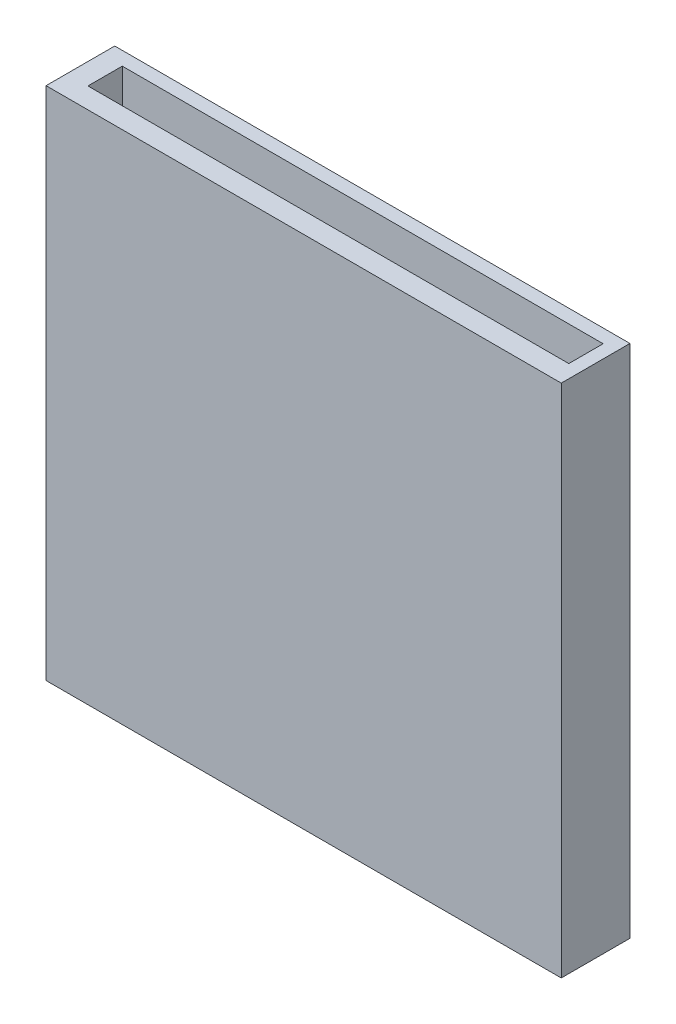
ISO-10303-21;
HEADER;
FILE_DESCRIPTION(('STEP AP214'),'2;1');
FILE_NAME('part.step','',(''),(''),'','','');
FILE_SCHEMA(('AUTOMOTIVE_DESIGN { 1 0 10303 214 1 1 1 1 }'));
ENDSEC;
DATA;
#1=APPLICATION_CONTEXT('core data for automotive mechanical design processes');
#2=APPLICATION_PROTOCOL_DEFINITION('international standard','automotive_design',2000,#1);
#3=PRODUCT_CONTEXT('',#1,'mechanical');
#4=PRODUCT('Part','Part','',(#3));
#5=PRODUCT_RELATED_PRODUCT_CATEGORY('part','',(#4));
#6=PRODUCT_DEFINITION_FORMATION('','',#4);
#7=PRODUCT_DEFINITION_CONTEXT('part definition',#1,'design');
#8=PRODUCT_DEFINITION('design','',#6,#7);
#9=PRODUCT_DEFINITION_SHAPE('','',#8);
#10=(LENGTH_UNIT() NAMED_UNIT(*) SI_UNIT(.MILLI.,.METRE.));
#11=(NAMED_UNIT(*) PLANE_ANGLE_UNIT() SI_UNIT($,.RADIAN.));
#12=(NAMED_UNIT(*) SI_UNIT($,.STERADIAN.) SOLID_ANGLE_UNIT());
#13=UNCERTAINTY_MEASURE_WITH_UNIT(LENGTH_MEASURE(1.E-05),#10,'distance_accuracy_value','');
#14=(GEOMETRIC_REPRESENTATION_CONTEXT(3) GLOBAL_UNCERTAINTY_ASSIGNED_CONTEXT((#13)) GLOBAL_UNIT_ASSIGNED_CONTEXT((#10,
#11,#12)) REPRESENTATION_CONTEXT('',''));
#15=CARTESIAN_POINT('',(0.,0.,0.));
#16=DIRECTION('',(0.,0.,1.));
#17=DIRECTION('',(1.,0.,0.));
#18=AXIS2_PLACEMENT_3D('',#15,#16,#17);
#19=CARTESIAN_POINT('',(-68.9842487720695,150.,-26.4972611177486));
#20=DIRECTION('',(1.,0.,0.));
#21=DIRECTION('',(0.,0.,-1.));
#22=AXIS2_PLACEMENT_3D('',#19,#20,#21);
#23=PLANE('',#22);
#24=DIRECTION('',(0.,0.,1.));
#25=VECTOR('',#24,1.);
#26=CARTESIAN_POINT('',(-68.9842487720695,0.,-26.4972611177486));
#27=LINE('',#26,#25);
#28=CARTESIAN_POINT('',(-68.9842487720695,0.,-26.4972611177486));
#29=VERTEX_POINT('',#28);
#30=CARTESIAN_POINT('',(-68.9842487720695,0.,-6.49726111774857));
#31=VERTEX_POINT('',#30);
#32=EDGE_CURVE('E143',#29,#31,#27,.T.);
#33=ORIENTED_EDGE('',*,*,#32,.T.);
#34=DIRECTION('',(0.,-1.,0.));
#35=VECTOR('',#34,1.);
#36=CARTESIAN_POINT('',(-68.9842487720695,150.,-6.49726111774857));
#37=LINE('',#36,#35);
#38=CARTESIAN_POINT('',(-68.9842487720695,150.,-6.49726111774857));
#39=VERTEX_POINT('',#38);
#40=EDGE_CURVE('E11',#39,#31,#37,.T.);
#41=ORIENTED_EDGE('',*,*,#40,.F.);
#42=DIRECTION('',(0.,0.,1.));
#43=VECTOR('',#42,1.);
#44=CARTESIAN_POINT('',(-68.9842487720695,150.,-26.4972611177486));
#45=LINE('',#44,#43);
#46=CARTESIAN_POINT('',(-68.9842487720695,150.,-26.4972611177486));
#47=VERTEX_POINT('',#46);
#48=EDGE_CURVE('E147',#47,#39,#45,.T.);
#49=ORIENTED_EDGE('',*,*,#48,.F.);
#50=DIRECTION('',(0.,-1.,0.));
#51=VECTOR('',#50,1.);
#52=CARTESIAN_POINT('',(-68.9842487720695,150.,-26.4972611177486));
#53=LINE('',#52,#51);
#54=EDGE_CURVE('E153',#47,#29,#53,.T.);
#55=ORIENTED_EDGE('',*,*,#54,.T.);
#56=EDGE_LOOP('',(#33,#41,#49,#55));
#57=FACE_BOUND('',#56,.T.);
#58=ADVANCED_FACE('F35',(#57),#23,.F.);
#59=CARTESIAN_POINT('',(-68.9842487720695,150.,-6.49726111774857));
#60=DIRECTION('',(0.,0.,-1.));
#61=DIRECTION('',(-1.,0.,0.));
#62=AXIS2_PLACEMENT_3D('',#59,#60,#61);
#63=PLANE('',#62);
#64=DIRECTION('',(1.,0.,0.));
#65=VECTOR('',#64,1.);
#66=CARTESIAN_POINT('',(-68.9842487720695,0.,-6.49726111774857));
#67=LINE('',#66,#65);
#68=CARTESIAN_POINT('',(81.0157512279305,0.,-6.49726111774857));
#69=VERTEX_POINT('',#68);
#70=EDGE_CURVE('E156',#31,#69,#67,.T.);
#71=ORIENTED_EDGE('',*,*,#70,.T.);
#72=DIRECTION('',(0.,-1.,0.));
#73=VECTOR('',#72,1.);
#74=CARTESIAN_POINT('',(81.0157512279305,150.,-6.49726111774857));
#75=LINE('',#74,#73);
#76=CARTESIAN_POINT('',(81.0157512279305,150.,-6.49726111774857));
#77=VERTEX_POINT('',#76);
#78=EDGE_CURVE('E42',#77,#69,#75,.T.);
#79=ORIENTED_EDGE('',*,*,#78,.F.);
#80=DIRECTION('',(1.,0.,0.));
#81=VECTOR('',#80,1.);
#82=CARTESIAN_POINT('',(-68.9842487720695,150.,-6.49726111774857));
#83=LINE('',#82,#81);
#84=EDGE_CURVE('E86',#39,#77,#83,.T.);
#85=ORIENTED_EDGE('',*,*,#84,.F.);
#86=ORIENTED_EDGE('',*,*,#40,.T.);
#87=EDGE_LOOP('',(#71,#79,#85,#86));
#88=FACE_BOUND('',#87,.T.);
#89=ADVANCED_FACE('F185',(#88),#63,.F.);
#90=CARTESIAN_POINT('',(81.0157512279305,150.,-26.4972611177486));
#91=DIRECTION('',(-1.,0.,0.));
#92=DIRECTION('',(0.,0.,1.));
#93=AXIS2_PLACEMENT_3D('',#90,#91,#92);
#94=PLANE('',#93);
#95=DIRECTION('',(0.,0.,-1.));
#96=VECTOR('',#95,1.);
#97=CARTESIAN_POINT('',(81.0157512279305,0.,-26.4972611177486));
#98=LINE('',#97,#96);
#99=CARTESIAN_POINT('',(81.0157512279305,0.,-26.4972611177486));
#100=VERTEX_POINT('',#99);
#101=EDGE_CURVE('E158',#69,#100,#98,.T.);
#102=ORIENTED_EDGE('',*,*,#101,.T.);
#103=DIRECTION('',(0.,-1.,0.));
#104=VECTOR('',#103,1.);
#105=CARTESIAN_POINT('',(81.0157512279305,150.,-26.4972611177486));
#106=LINE('',#105,#104);
#107=CARTESIAN_POINT('',(81.0157512279305,150.,-26.4972611177486));
#108=VERTEX_POINT('',#107);
#109=EDGE_CURVE('E162',#108,#100,#106,.T.);
#110=ORIENTED_EDGE('',*,*,#109,.F.);
#111=DIRECTION('',(0.,0.,-1.));
#112=VECTOR('',#111,1.);
#113=CARTESIAN_POINT('',(81.0157512279305,150.,-26.4972611177486));
#114=LINE('',#113,#112);
#115=EDGE_CURVE('E150',#77,#108,#114,.T.);
#116=ORIENTED_EDGE('',*,*,#115,.F.);
#117=ORIENTED_EDGE('',*,*,#78,.T.);
#118=EDGE_LOOP('',(#102,#110,#116,#117));
#119=FACE_BOUND('',#118,.T.);
#120=ADVANCED_FACE('F167',(#119),#94,.F.);
#121=CARTESIAN_POINT('',(-68.9842487720695,150.,-26.4972611177486));
#122=DIRECTION('',(0.,0.,1.));
#123=DIRECTION('',(1.,0.,0.));
#124=AXIS2_PLACEMENT_3D('',#121,#122,#123);
#125=PLANE('',#124);
#126=DIRECTION('',(-1.,0.,0.));
#127=VECTOR('',#126,1.);
#128=CARTESIAN_POINT('',(-68.9842487720695,0.,-26.4972611177486));
#129=LINE('',#128,#127);
#130=EDGE_CURVE('E79',#100,#29,#129,.T.);
#131=ORIENTED_EDGE('',*,*,#130,.T.);
#132=ORIENTED_EDGE('',*,*,#54,.F.);
#133=DIRECTION('',(-1.,0.,0.));
#134=VECTOR('',#133,1.);
#135=CARTESIAN_POINT('',(-68.9842487720695,150.,-26.4972611177486));
#136=LINE('',#135,#134);
#137=EDGE_CURVE('E58',#108,#47,#136,.T.);
#138=ORIENTED_EDGE('',*,*,#137,.F.);
#139=ORIENTED_EDGE('',*,*,#109,.T.);
#140=EDGE_LOOP('',(#131,#132,#138,#139));
#141=FACE_BOUND('',#140,.T.);
#142=ADVANCED_FACE('F175',(#141),#125,.F.);
#143=CARTESIAN_POINT('',(0.,150.,0.));
#144=DIRECTION('',(0.,1.,0.));
#145=DIRECTION('',(0.,0.,1.));
#146=AXIS2_PLACEMENT_3D('',#143,#144,#145);
#147=PLANE('',#146);
#148=DIRECTION('',(0.,0.,1.));
#149=VECTOR('',#148,1.);
#150=CARTESIAN_POINT('',(-62.8156382090959,150.,-22.5200554369218));
#151=LINE('',#150,#149);
#152=CARTESIAN_POINT('',(-62.8156382090959,150.,-22.5200554369218));
#153=VERTEX_POINT('',#152);
#154=CARTESIAN_POINT('',(-62.8156382090959,150.,-12.5200554369218));
#155=VERTEX_POINT('',#154);
#156=EDGE_CURVE('E49',#153,#155,#151,.T.);
#157=ORIENTED_EDGE('',*,*,#156,.F.);
#158=DIRECTION('',(-1.,0.,0.));
#159=VECTOR('',#158,1.);
#160=CARTESIAN_POINT('',(-62.8156382090959,150.,-22.5200554369218));
#161=LINE('',#160,#159);
#162=CARTESIAN_POINT('',(77.1843617909041,150.,-22.5200554369218));
#163=VERTEX_POINT('',#162);
#164=EDGE_CURVE('E128',#163,#153,#161,.T.);
#165=ORIENTED_EDGE('',*,*,#164,.F.);
#166=DIRECTION('',(0.,0.,-1.));
#167=VECTOR('',#166,1.);
#168=CARTESIAN_POINT('',(77.1843617909041,150.,-22.5200554369218));
#169=LINE('',#168,#167);
#170=CARTESIAN_POINT('',(77.1843617909041,150.,-12.5200554369218));
#171=VERTEX_POINT('',#170);
#172=EDGE_CURVE('E131',#171,#163,#169,.T.);
#173=ORIENTED_EDGE('',*,*,#172,.F.);
#174=DIRECTION('',(1.,0.,0.));
#175=VECTOR('',#174,1.);
#176=CARTESIAN_POINT('',(-62.8156382090959,150.,-12.5200554369218));
#177=LINE('',#176,#175);
#178=EDGE_CURVE('E137',#155,#171,#177,.T.);
#179=ORIENTED_EDGE('',*,*,#178,.F.);
#180=EDGE_LOOP('',(#157,#165,#173,#179));
#181=FACE_BOUND('',#180,.T.);
#182=ORIENTED_EDGE('',*,*,#48,.T.);
#183=ORIENTED_EDGE('',*,*,#84,.T.);
#184=ORIENTED_EDGE('',*,*,#115,.T.);
#185=ORIENTED_EDGE('',*,*,#137,.T.);
#186=EDGE_LOOP('',(#182,#183,#184,#185));
#187=FACE_BOUND('',#186,.T.);
#188=ADVANCED_FACE('F177',(#181,#187),#147,.T.);
#189=CARTESIAN_POINT('',(0.,0.,0.));
#190=DIRECTION('',(0.,1.,0.));
#191=DIRECTION('',(0.,0.,1.));
#192=AXIS2_PLACEMENT_3D('',#189,#190,#191);
#193=PLANE('',#192);
#194=ORIENTED_EDGE('',*,*,#32,.F.);
#195=ORIENTED_EDGE('',*,*,#130,.F.);
#196=ORIENTED_EDGE('',*,*,#101,.F.);
#197=ORIENTED_EDGE('',*,*,#70,.F.);
#198=EDGE_LOOP('',(#194,#195,#196,#197));
#199=FACE_BOUND('',#198,.T.);
#200=ADVANCED_FACE('F171',(#199),#193,.F.);
#201=CARTESIAN_POINT('',(-62.8156382090959,5.,-22.5200554369218));
#202=DIRECTION('',(-1.,0.,0.));
#203=DIRECTION('',(0.,0.,1.));
#204=AXIS2_PLACEMENT_3D('',#201,#202,#203);
#205=PLANE('',#204);
#206=ORIENTED_EDGE('',*,*,#156,.T.);
#207=DIRECTION('',(0.,1.,0.));
#208=VECTOR('',#207,1.);
#209=CARTESIAN_POINT('',(-62.8156382090959,5.,-12.5200554369218));
#210=LINE('',#209,#208);
#211=CARTESIAN_POINT('',(-62.8156382090959,5.,-12.5200554369218));
#212=VERTEX_POINT('',#211);
#213=EDGE_CURVE('E106',#212,#155,#210,.T.);
#214=ORIENTED_EDGE('',*,*,#213,.F.);
#215=DIRECTION('',(0.,0.,1.));
#216=VECTOR('',#215,1.);
#217=CARTESIAN_POINT('',(-62.8156382090959,5.,-22.5200554369218));
#218=LINE('',#217,#216);
#219=CARTESIAN_POINT('',(-62.8156382090959,5.,-22.5200554369218));
#220=VERTEX_POINT('',#219);
#221=EDGE_CURVE('E110',#220,#212,#218,.T.);
#222=ORIENTED_EDGE('',*,*,#221,.F.);
#223=DIRECTION('',(0.,1.,0.));
#224=VECTOR('',#223,1.);
#225=CARTESIAN_POINT('',(-62.8156382090959,5.,-22.5200554369218));
#226=LINE('',#225,#224);
#227=EDGE_CURVE('E141',#220,#153,#226,.T.);
#228=ORIENTED_EDGE('',*,*,#227,.T.);
#229=EDGE_LOOP('',(#206,#214,#222,#228));
#230=FACE_BOUND('',#229,.T.);
#231=ADVANCED_FACE('F108',(#230),#205,.F.);
#232=CARTESIAN_POINT('',(-62.8156382090959,5.,-22.5200554369218));
#233=DIRECTION('',(0.,0.,-1.));
#234=DIRECTION('',(-1.,0.,0.));
#235=AXIS2_PLACEMENT_3D('',#232,#233,#234);
#236=PLANE('',#235);
#237=ORIENTED_EDGE('',*,*,#164,.T.);
#238=ORIENTED_EDGE('',*,*,#227,.F.);
#239=DIRECTION('',(-1.,0.,0.));
#240=VECTOR('',#239,1.);
#241=CARTESIAN_POINT('',(-62.8156382090959,5.,-22.5200554369218));
#242=LINE('',#241,#240);
#243=CARTESIAN_POINT('',(77.1843617909041,5.,-22.5200554369218));
#244=VERTEX_POINT('',#243);
#245=EDGE_CURVE('E116',#244,#220,#242,.T.);
#246=ORIENTED_EDGE('',*,*,#245,.F.);
#247=DIRECTION('',(0.,1.,0.));
#248=VECTOR('',#247,1.);
#249=CARTESIAN_POINT('',(77.1843617909041,5.,-22.5200554369218));
#250=LINE('',#249,#248);
#251=EDGE_CURVE('E144',#244,#163,#250,.T.);
#252=ORIENTED_EDGE('',*,*,#251,.T.);
#253=EDGE_LOOP('',(#237,#238,#246,#252));
#254=FACE_BOUND('',#253,.T.);
#255=ADVANCED_FACE('F224',(#254),#236,.F.);
#256=CARTESIAN_POINT('',(77.1843617909041,5.,-22.5200554369218));
#257=DIRECTION('',(1.,0.,0.));
#258=DIRECTION('',(0.,0.,-1.));
#259=AXIS2_PLACEMENT_3D('',#256,#257,#258);
#260=PLANE('',#259);
#261=ORIENTED_EDGE('',*,*,#172,.T.);
#262=ORIENTED_EDGE('',*,*,#251,.F.);
#263=DIRECTION('',(0.,0.,-1.));
#264=VECTOR('',#263,1.);
#265=CARTESIAN_POINT('',(77.1843617909041,5.,-22.5200554369218));
#266=LINE('',#265,#264);
#267=CARTESIAN_POINT('',(77.1843617909041,5.,-12.5200554369218));
#268=VERTEX_POINT('',#267);
#269=EDGE_CURVE('E124',#268,#244,#266,.T.);
#270=ORIENTED_EDGE('',*,*,#269,.F.);
#271=DIRECTION('',(0.,1.,0.));
#272=VECTOR('',#271,1.);
#273=CARTESIAN_POINT('',(77.1843617909041,5.,-12.5200554369218));
#274=LINE('',#273,#272);
#275=EDGE_CURVE('E115',#268,#171,#274,.T.);
#276=ORIENTED_EDGE('',*,*,#275,.T.);
#277=EDGE_LOOP('',(#261,#262,#270,#276));
#278=FACE_BOUND('',#277,.T.);
#279=ADVANCED_FACE('F233',(#278),#260,.F.);
#280=CARTESIAN_POINT('',(-62.8156382090959,5.,-12.5200554369218));
#281=DIRECTION('',(0.,0.,1.));
#282=DIRECTION('',(1.,0.,0.));
#283=AXIS2_PLACEMENT_3D('',#280,#281,#282);
#284=PLANE('',#283);
#285=ORIENTED_EDGE('',*,*,#178,.T.);
#286=ORIENTED_EDGE('',*,*,#275,.F.);
#287=DIRECTION('',(1.,0.,0.));
#288=VECTOR('',#287,1.);
#289=CARTESIAN_POINT('',(-62.8156382090959,5.,-12.5200554369218));
#290=LINE('',#289,#288);
#291=EDGE_CURVE('E119',#212,#268,#290,.T.);
#292=ORIENTED_EDGE('',*,*,#291,.F.);
#293=ORIENTED_EDGE('',*,*,#213,.T.);
#294=EDGE_LOOP('',(#285,#286,#292,#293));
#295=FACE_BOUND('',#294,.T.);
#296=ADVANCED_FACE('F120',(#295),#284,.F.);
#297=CARTESIAN_POINT('',(0.,5.,0.));
#298=DIRECTION('',(0.,1.,0.));
#299=DIRECTION('',(0.,0.,1.));
#300=AXIS2_PLACEMENT_3D('',#297,#298,#299);
#301=PLANE('',#300);
#302=ORIENTED_EDGE('',*,*,#221,.T.);
#303=ORIENTED_EDGE('',*,*,#291,.T.);
#304=ORIENTED_EDGE('',*,*,#269,.T.);
#305=ORIENTED_EDGE('',*,*,#245,.T.);
#306=EDGE_LOOP('',(#302,#303,#304,#305));
#307=FACE_BOUND('',#306,.T.);
#308=ADVANCED_FACE('F126',(#307),#301,.T.);
#309=CLOSED_SHELL('',(#58,#89,#120,#142,#188,#200,#231,#255,#279,#296,#308));
#310=MANIFOLD_SOLID_BREP('B2',#309);
#311=ADVANCED_BREP_SHAPE_REPRESENTATION('',(#18,#310),#14);
#312=SHAPE_DEFINITION_REPRESENTATION(#9,#311);
ENDSEC;
END-ISO-10303-21;
